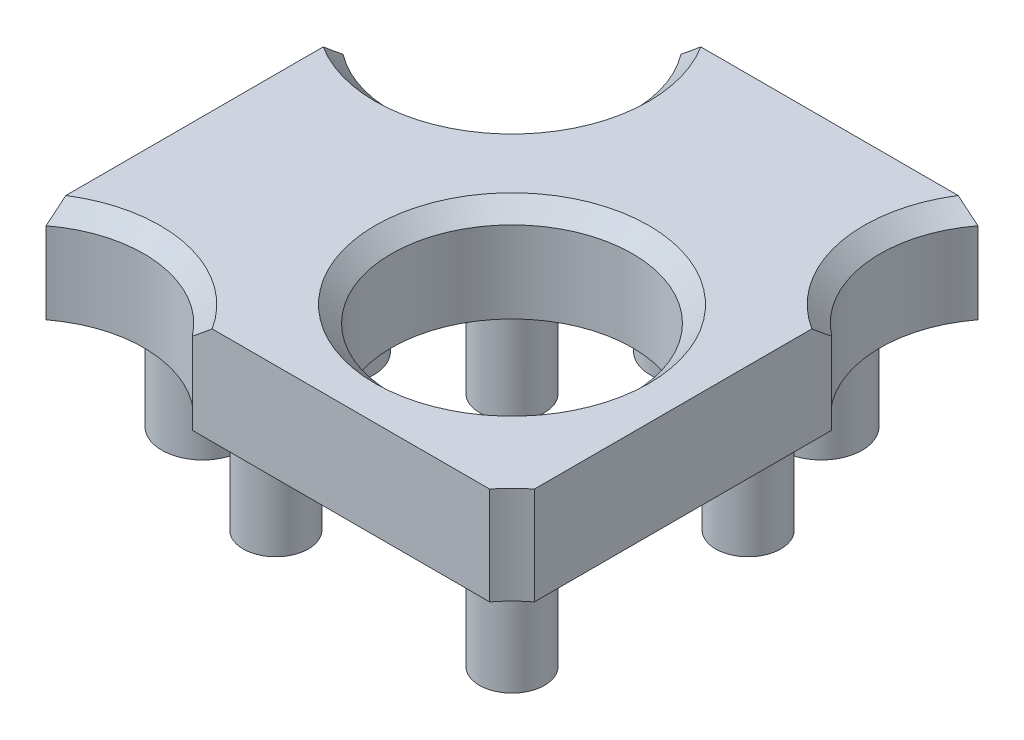
ISO-10303-21;
HEADER;
FILE_DESCRIPTION(('STEP AP214'),'2;1');
FILE_NAME('part.step','',(''),(''),'','','');
FILE_SCHEMA(('AUTOMOTIVE_DESIGN { 1 0 10303 214 1 1 1 1 }'));
ENDSEC;
DATA;
#1=APPLICATION_CONTEXT('core data for automotive mechanical design processes');
#2=APPLICATION_PROTOCOL_DEFINITION('international standard','automotive_design',2000,#1);
#3=PRODUCT_CONTEXT('',#1,'mechanical');
#4=PRODUCT('Part','Part','',(#3));
#5=PRODUCT_RELATED_PRODUCT_CATEGORY('part','',(#4));
#6=PRODUCT_DEFINITION_FORMATION('','',#4);
#7=PRODUCT_DEFINITION_CONTEXT('part definition',#1,'design');
#8=PRODUCT_DEFINITION('design','',#6,#7);
#9=PRODUCT_DEFINITION_SHAPE('','',#8);
#10=(LENGTH_UNIT() NAMED_UNIT(*) SI_UNIT(.MILLI.,.METRE.));
#11=(NAMED_UNIT(*) PLANE_ANGLE_UNIT() SI_UNIT($,.RADIAN.));
#12=(NAMED_UNIT(*) SI_UNIT($,.STERADIAN.) SOLID_ANGLE_UNIT());
#13=UNCERTAINTY_MEASURE_WITH_UNIT(LENGTH_MEASURE(1.E-05),#10,'distance_accuracy_value','');
#14=(GEOMETRIC_REPRESENTATION_CONTEXT(3) GLOBAL_UNCERTAINTY_ASSIGNED_CONTEXT((#13)) GLOBAL_UNIT_ASSIGNED_CONTEXT((#10,
#11,#12)) REPRESENTATION_CONTEXT('',''));
#15=CARTESIAN_POINT('',(0.,0.,0.));
#16=DIRECTION('',(0.,0.,1.));
#17=DIRECTION('',(1.,0.,0.));
#18=AXIS2_PLACEMENT_3D('',#15,#16,#17);
#19=CARTESIAN_POINT('',(10.5,12.,10.5));
#20=DIRECTION('',(-1.,0.,0.));
#21=DIRECTION('',(0.,0.,1.));
#22=AXIS2_PLACEMENT_3D('',#19,#20,#21);
#23=PLANE('',#22);
#24=DIRECTION('',(0.,1.,0.));
#25=VECTOR('',#24,1.);
#26=CARTESIAN_POINT('',(10.5,1.,-9.12547874291017));
#27=LINE('',#26,#25);
#28=CARTESIAN_POINT('',(10.5,6.,-9.12547874291017));
#29=VERTEX_POINT('',#28);
#30=CARTESIAN_POINT('',(10.5,11.,-9.12547874291017));
#31=VERTEX_POINT('',#30);
#32=EDGE_CURVE('E418',#29,#31,#27,.T.);
#33=ORIENTED_EDGE('',*,*,#32,.T.);
#34=CARTESIAN_POINT('',(10.5,11.,-9.12547874291017));
#35=CARTESIAN_POINT('',(10.5,11.0816793844325,-9.02259457323716));
#36=CARTESIAN_POINT('',(10.5,11.1638393771911,-8.92009342663814));
#37=CARTESIAN_POINT('',(10.5,11.329013575507,-8.71579109963367));
#38=CARTESIAN_POINT('',(10.5,11.4120277323689,-8.61398987987178));
#39=CARTESIAN_POINT('',(10.5,11.5788116752335,-8.41101072911728));
#40=CARTESIAN_POINT('',(10.5,11.6625814533899,-8.30983279167083));
#41=CARTESIAN_POINT('',(10.5,11.8308015923563,-8.10803441972613));
#42=CARTESIAN_POINT('',(10.5,11.9152519914586,-8.0074140171402));
#43=CARTESIAN_POINT('',(10.5,12.,-7.9070457494778));
#44=B_SPLINE_CURVE_WITH_KNOTS('',3,(#34,#35,#36,#37,#38,#39,#40,#41,#42,#43),.UNSPECIFIED.,.F.,
.F.,(4,2,2,2,4),(0.,0.394090890222562,0.788159436703919,1.18222389588493,1.57631068233785),.UNSPECIFIED.);
#45=CARTESIAN_POINT('',(10.5,12.,-7.90704574947783));
#46=VERTEX_POINT('',#45);
#47=EDGE_CURVE('E72',#31,#46,#44,.T.);
#48=ORIENTED_EDGE('',*,*,#47,.T.);
#49=DIRECTION('',(0.,0.,-1.));
#50=VECTOR('',#49,1.);
#51=CARTESIAN_POINT('',(10.5,12.,10.5));
#52=LINE('',#51,#50);
#53=CARTESIAN_POINT('',(10.5,12.,9.12547874291018));
#54=VERTEX_POINT('',#53);
#55=EDGE_CURVE('E193',#54,#46,#52,.T.);
#56=ORIENTED_EDGE('',*,*,#55,.F.);
#57=DIRECTION('',(0.,1.,0.));
#58=VECTOR('',#57,1.);
#59=CARTESIAN_POINT('',(10.5,1.,9.12547874291018));
#60=LINE('',#59,#58);
#61=CARTESIAN_POINT('',(10.5,6.,9.12547874291018));
#62=VERTEX_POINT('',#61);
#63=EDGE_CURVE('E424',#54,#62,#60,.F.);
#64=ORIENTED_EDGE('',*,*,#63,.T.);
#65=DIRECTION('',(0.,0.,1.));
#66=VECTOR('',#65,1.);
#67=CARTESIAN_POINT('',(10.5,6.,-19.49));
#68=LINE('',#67,#66);
#69=EDGE_CURVE('E189',#29,#62,#68,.T.);
#70=ORIENTED_EDGE('',*,*,#69,.F.);
#71=EDGE_LOOP('',(#33,#48,#56,#64,#70));
#72=FACE_BOUND('',#71,.T.);
#73=ADVANCED_FACE('F48',(#72),#23,.F.);
#74=CARTESIAN_POINT('',(-10.5,12.,10.5));
#75=DIRECTION('',(0.,0.,-1.));
#76=DIRECTION('',(-1.,0.,0.));
#77=AXIS2_PLACEMENT_3D('',#74,#75,#76);
#78=PLANE('',#77);
#79=DIRECTION('',(1.,0.,0.));
#80=VECTOR('',#79,1.);
#81=CARTESIAN_POINT('',(-10.5,12.,10.5));
#82=LINE('',#81,#80);
#83=CARTESIAN_POINT('',(-7.90704574947792,12.,10.5));
#84=VERTEX_POINT('',#83);
#85=CARTESIAN_POINT('',(9.12547874291021,12.,10.5));
#86=VERTEX_POINT('',#85);
#87=EDGE_CURVE('E196',#84,#86,#82,.T.);
#88=ORIENTED_EDGE('',*,*,#87,.F.);
#89=CARTESIAN_POINT('',(-7.90704574947792,12.,10.5));
#90=CARTESIAN_POINT('',(-8.00741401714029,11.9152519914586,10.5));
#91=CARTESIAN_POINT('',(-8.10803441972621,11.8308015923563,10.5));
#92=CARTESIAN_POINT('',(-8.3098327916709,11.6625814533899,10.5));
#93=CARTESIAN_POINT('',(-8.41101072911735,11.5788116752335,10.5));
#94=CARTESIAN_POINT('',(-8.61398987987186,11.4120277323689,10.5));
#95=CARTESIAN_POINT('',(-8.71579109963375,11.3290135755071,10.5));
#96=CARTESIAN_POINT('',(-8.9200934266382,11.1638393771911,10.5));
#97=CARTESIAN_POINT('',(-9.0225945732372,11.0816793844324,10.5));
#98=CARTESIAN_POINT('',(-9.12547874291016,10.9999999999999,10.5));
#99=B_SPLINE_CURVE_WITH_KNOTS('',3,(#89,#90,#91,#92,#93,#94,#95,#96,#97,#98),.UNSPECIFIED.,.F.,
.F.,(4,2,2,2,4),(0.,0.39408678645292,0.78815124563393,1.18221979211528,1.57631068233784),.UNSPECIFIED.);
#100=CARTESIAN_POINT('',(-9.12547874291024,11.,10.5));
#101=VERTEX_POINT('',#100);
#102=EDGE_CURVE('E431',#84,#101,#99,.T.);
#103=ORIENTED_EDGE('',*,*,#102,.T.);
#104=DIRECTION('',(0.,1.,0.));
#105=VECTOR('',#104,1.);
#106=CARTESIAN_POINT('',(-9.12547874291024,1.,10.5));
#107=LINE('',#106,#105);
#108=CARTESIAN_POINT('',(-9.12547874291024,6.,10.5));
#109=VERTEX_POINT('',#108);
#110=EDGE_CURVE('E158',#101,#109,#107,.F.);
#111=ORIENTED_EDGE('',*,*,#110,.T.);
#112=DIRECTION('',(-1.,0.,0.));
#113=VECTOR('',#112,1.);
#114=CARTESIAN_POINT('',(-10.5,6.,10.5));
#115=LINE('',#114,#113);
#116=CARTESIAN_POINT('',(9.12547874291021,6.,10.5));
#117=VERTEX_POINT('',#116);
#118=EDGE_CURVE('E157',#117,#109,#115,.T.);
#119=ORIENTED_EDGE('',*,*,#118,.F.);
#120=DIRECTION('',(0.,1.,0.));
#121=VECTOR('',#120,1.);
#122=CARTESIAN_POINT('',(9.12547874291021,1.,10.5));
#123=LINE('',#122,#121);
#124=EDGE_CURVE('E421',#117,#86,#123,.T.);
#125=ORIENTED_EDGE('',*,*,#124,.T.);
#126=EDGE_LOOP('',(#88,#103,#111,#119,#125));
#127=FACE_BOUND('',#126,.T.);
#128=ADVANCED_FACE('F304',(#127),#78,.F.);
#129=CARTESIAN_POINT('',(0.,12.,0.));
#130=DIRECTION('',(0.,-1.,0.));
#131=DIRECTION('',(0.,0.,-1.));
#132=AXIS2_PLACEMENT_3D('',#129,#130,#131);
#133=PLANE('',#132);
#134=CARTESIAN_POINT('',(0.,12.,0.));
#135=DIRECTION('',(0.,-1.,0.));
#136=DIRECTION('',(0.,0.,-1.));
#137=AXIS2_PLACEMENT_3D('',#134,#135,#136);
#138=CIRCLE('',#137,8.4);
#139=CARTESIAN_POINT('',(0.,12.,-8.4));
#140=VERTEX_POINT('',#139);
#141=EDGE_CURVE('E224',#140,#140,#138,.T.);
#142=ORIENTED_EDGE('',*,*,#141,.T.);
#143=EDGE_LOOP('',(#142));
#144=FACE_BOUND('',#143,.T.);
#145=DIRECTION('',(0.,0.,-1.));
#146=VECTOR('',#145,1.);
#147=CARTESIAN_POINT('',(-19.49,12.,-10.4999999999999));
#148=LINE('',#147,#146);
#149=CARTESIAN_POINT('',(-19.49,12.,7.90071130323578));
#150=VERTEX_POINT('',#149);
#151=CARTESIAN_POINT('',(-19.49,12.,-7.9007113032361));
#152=VERTEX_POINT('',#151);
#153=EDGE_CURVE('E164',#150,#152,#148,.T.);
#154=ORIENTED_EDGE('',*,*,#153,.F.);
#155=CARTESIAN_POINT('',(-15.0000000000002,12.,14.9999999999998));
#156=DIRECTION('',(0.,-1.,0.));
#157=DIRECTION('',(0.,0.,-1.));
#158=AXIS2_PLACEMENT_3D('',#155,#156,#157);
#159=CIRCLE('',#158,8.40000000000002);
#160=EDGE_CURVE('E432',#150,#84,#159,.T.);
#161=ORIENTED_EDGE('',*,*,#160,.T.);
#162=ORIENTED_EDGE('',*,*,#87,.T.);
#163=CARTESIAN_POINT('',(15.,12.,15.));
#164=DIRECTION('',(0.,1.,0.));
#165=DIRECTION('',(0.,0.,-1.));
#166=AXIS2_PLACEMENT_3D('',#163,#164,#165);
#167=CIRCLE('',#166,7.4);
#168=EDGE_CURVE('E159',#54,#86,#167,.T.);
#169=ORIENTED_EDGE('',*,*,#168,.F.);
#170=ORIENTED_EDGE('',*,*,#55,.T.);
#171=CARTESIAN_POINT('',(15.0000000000001,12.,-14.9999999999999));
#172=DIRECTION('',(0.,-1.,0.));
#173=DIRECTION('',(0.,0.,-1.));
#174=AXIS2_PLACEMENT_3D('',#171,#172,#173);
#175=CIRCLE('',#174,8.40000000000001);
#176=CARTESIAN_POINT('',(7.90071130323616,12.,-19.49));
#177=VERTEX_POINT('',#176);
#178=EDGE_CURVE('E436',#46,#177,#175,.T.);
#179=ORIENTED_EDGE('',*,*,#178,.T.);
#180=DIRECTION('',(1.,0.,0.));
#181=VECTOR('',#180,1.);
#182=CARTESIAN_POINT('',(10.5,12.,-19.49));
#183=LINE('',#182,#181);
#184=CARTESIAN_POINT('',(-7.90071130323607,12.,-19.49));
#185=VERTEX_POINT('',#184);
#186=EDGE_CURVE('E186',#185,#177,#183,.T.);
#187=ORIENTED_EDGE('',*,*,#186,.F.);
#188=CARTESIAN_POINT('',(-15.,12.,-15.));
#189=DIRECTION('',(0.,-1.,0.));
#190=DIRECTION('',(0.,0.,-1.));
#191=AXIS2_PLACEMENT_3D('',#188,#189,#190);
#192=CIRCLE('',#191,8.4);
#193=EDGE_CURVE('E443',#185,#152,#192,.T.);
#194=ORIENTED_EDGE('',*,*,#193,.T.);
#195=EDGE_LOOP('',(#154,#161,#162,#169,#170,#179,#187,#194));
#196=FACE_BOUND('',#195,.T.);
#197=ADVANCED_FACE('F330',(#144,#196),#133,.F.);
#198=CARTESIAN_POINT('',(0.,-0.000999999999999265,0.));
#199=DIRECTION('',(0.,1.,0.));
#200=DIRECTION('',(0.,0.,1.));
#201=AXIS2_PLACEMENT_3D('',#198,#199,#200);
#202=CYLINDRICAL_SURFACE('',#201,7.4);
#203=CARTESIAN_POINT('',(0.,11.,0.));
#204=DIRECTION('',(0.,-1.,0.));
#205=DIRECTION('',(0.,0.,-1.));
#206=AXIS2_PLACEMENT_3D('',#203,#204,#205);
#207=CIRCLE('',#206,7.4);
#208=CARTESIAN_POINT('',(0.,11.,-7.4));
#209=VERTEX_POINT('',#208);
#210=EDGE_CURVE('E221',#209,#209,#207,.F.);
#211=ORIENTED_EDGE('',*,*,#210,.T.);
#212=EDGE_LOOP('',(#211));
#213=FACE_BOUND('',#212,.T.);
#214=CARTESIAN_POINT('',(0.,6.,0.));
#215=DIRECTION('',(0.,1.,0.));
#216=DIRECTION('',(0.,0.,1.));
#217=AXIS2_PLACEMENT_3D('',#214,#215,#216);
#218=CIRCLE('',#217,7.4);
#219=CARTESIAN_POINT('',(0.,6.,7.4));
#220=VERTEX_POINT('',#219);
#221=EDGE_CURVE('E333',#220,#220,#218,.F.);
#222=ORIENTED_EDGE('',*,*,#221,.T.);
#223=EDGE_LOOP('',(#222));
#224=FACE_BOUND('',#223,.T.);
#225=ADVANCED_FACE('F328',(#213,#224),#202,.F.);
#226=CARTESIAN_POINT('',(10.5,6.,-19.49));
#227=DIRECTION('',(0.,1.,0.));
#228=DIRECTION('',(0.,0.,1.));
#229=AXIS2_PLACEMENT_3D('',#226,#227,#228);
#230=PLANE('',#229);
#231=CARTESIAN_POINT('',(-7.25,6.,-7.25000000000001));
#232=DIRECTION('',(0.,1.,0.));
#233=DIRECTION('',(0.,0.,1.));
#234=AXIS2_PLACEMENT_3D('',#231,#232,#233);
#235=CIRCLE('',#234,2.);
#236=CARTESIAN_POINT('',(-7.25,6.,-5.25000000000001));
#237=VERTEX_POINT('',#236);
#238=EDGE_CURVE('E218',#237,#237,#235,.F.);
#239=ORIENTED_EDGE('',*,*,#238,.F.);
#240=EDGE_LOOP('',(#239));
#241=FACE_BOUND('',#240,.T.);
#242=CARTESIAN_POINT('',(7.24999999999998,6.,-7.25000000000003));
#243=DIRECTION('',(0.,1.,0.));
#244=DIRECTION('',(0.,0.,1.));
#245=AXIS2_PLACEMENT_3D('',#242,#243,#244);
#246=CIRCLE('',#245,2.);
#247=CARTESIAN_POINT('',(7.24999999999998,6.,-5.25000000000003));
#248=VERTEX_POINT('',#247);
#249=EDGE_CURVE('E215',#248,#248,#246,.F.);
#250=ORIENTED_EDGE('',*,*,#249,.F.);
#251=EDGE_LOOP('',(#250));
#252=FACE_BOUND('',#251,.T.);
#253=CARTESIAN_POINT('',(7.24999999999995,6.,7.25000000000006));
#254=DIRECTION('',(0.,1.,0.));
#255=DIRECTION('',(0.,0.,1.));
#256=AXIS2_PLACEMENT_3D('',#253,#254,#255);
#257=CIRCLE('',#256,2.);
#258=CARTESIAN_POINT('',(7.24999999999995,6.,9.25000000000006));
#259=VERTEX_POINT('',#258);
#260=EDGE_CURVE('E212',#259,#259,#257,.F.);
#261=ORIENTED_EDGE('',*,*,#260,.F.);
#262=EDGE_LOOP('',(#261));
#263=FACE_BOUND('',#262,.T.);
#264=CARTESIAN_POINT('',(-7.24999999999998,6.,7.25000000000003));
#265=DIRECTION('',(0.,1.,0.));
#266=DIRECTION('',(0.,0.,1.));
#267=AXIS2_PLACEMENT_3D('',#264,#265,#266);
#268=CIRCLE('',#267,2.);
#269=CARTESIAN_POINT('',(-7.24999999999998,6.,9.25000000000003));
#270=VERTEX_POINT('',#269);
#271=EDGE_CURVE('E209',#270,#270,#268,.F.);
#272=ORIENTED_EDGE('',*,*,#271,.F.);
#273=EDGE_LOOP('',(#272));
#274=FACE_BOUND('',#273,.T.);
#275=CARTESIAN_POINT('',(-4.,6.,-14.995));
#276=DIRECTION('',(0.,1.,0.));
#277=DIRECTION('',(0.,0.,-1.));
#278=AXIS2_PLACEMENT_3D('',#275,#276,#277);
#279=CIRCLE('',#278,2.5);
#280=CARTESIAN_POINT('',(-4.,6.,-17.495));
#281=VERTEX_POINT('',#280);
#282=EDGE_CURVE('E168',#281,#281,#279,.T.);
#283=ORIENTED_EDGE('',*,*,#282,.T.);
#284=EDGE_LOOP('',(#283));
#285=FACE_BOUND('',#284,.T.);
#286=CARTESIAN_POINT('',(4.,6.,-14.995));
#287=DIRECTION('',(0.,1.,0.));
#288=DIRECTION('',(0.,0.,1.));
#289=AXIS2_PLACEMENT_3D('',#286,#287,#288);
#290=CIRCLE('',#289,2.5);
#291=CARTESIAN_POINT('',(4.,6.,-12.495));
#292=VERTEX_POINT('',#291);
#293=EDGE_CURVE('E198',#292,#292,#290,.F.);
#294=ORIENTED_EDGE('',*,*,#293,.F.);
#295=EDGE_LOOP('',(#294));
#296=FACE_BOUND('',#295,.T.);
#297=DIRECTION('',(-1.,0.,0.));
#298=VECTOR('',#297,1.);
#299=CARTESIAN_POINT('',(10.5,6.,-19.49));
#300=LINE('',#299,#298);
#301=CARTESIAN_POINT('',(9.11783203232015,6.,-19.49));
#302=VERTEX_POINT('',#301);
#303=CARTESIAN_POINT('',(-9.11783203232006,6.,-19.49));
#304=VERTEX_POINT('',#303);
#305=EDGE_CURVE('E183',#302,#304,#300,.T.);
#306=ORIENTED_EDGE('',*,*,#305,.F.);
#307=CARTESIAN_POINT('',(15.0000000000001,6.,-14.9999999999999));
#308=DIRECTION('',(0.,1.,0.));
#309=DIRECTION('',(0.,0.,1.));
#310=AXIS2_PLACEMENT_3D('',#307,#308,#309);
#311=CIRCLE('',#310,7.4);
#312=EDGE_CURVE('E415',#302,#29,#311,.T.);
#313=ORIENTED_EDGE('',*,*,#312,.T.);
#314=ORIENTED_EDGE('',*,*,#69,.T.);
#315=CARTESIAN_POINT('',(15.,6.,15.));
#316=DIRECTION('',(0.,1.,0.));
#317=DIRECTION('',(0.,0.,1.));
#318=AXIS2_PLACEMENT_3D('',#315,#316,#317);
#319=CIRCLE('',#318,7.4);
#320=EDGE_CURVE('E207',#62,#117,#319,.T.);
#321=ORIENTED_EDGE('',*,*,#320,.T.);
#322=ORIENTED_EDGE('',*,*,#118,.T.);
#323=CARTESIAN_POINT('',(-15.0000000000002,6.,14.9999999999998));
#324=DIRECTION('',(0.,1.,0.));
#325=DIRECTION('',(0.,0.,1.));
#326=AXIS2_PLACEMENT_3D('',#323,#324,#325);
#327=CIRCLE('',#326,7.4);
#328=CARTESIAN_POINT('',(-19.49,6.,9.11783203231976));
#329=VERTEX_POINT('',#328);
#330=EDGE_CURVE('E139',#109,#329,#327,.T.);
#331=ORIENTED_EDGE('',*,*,#330,.T.);
#332=DIRECTION('',(0.,0.,1.));
#333=VECTOR('',#332,1.);
#334=CARTESIAN_POINT('',(-19.49,6.,-10.4999999999999));
#335=LINE('',#334,#333);
#336=CARTESIAN_POINT('',(-19.49,6.,-9.11783203232008));
#337=VERTEX_POINT('',#336);
#338=EDGE_CURVE('E154',#337,#329,#335,.T.);
#339=ORIENTED_EDGE('',*,*,#338,.F.);
#340=CARTESIAN_POINT('',(-15.,6.,-15.));
#341=DIRECTION('',(0.,1.,0.));
#342=DIRECTION('',(0.,0.,1.));
#343=AXIS2_PLACEMENT_3D('',#340,#341,#342);
#344=CIRCLE('',#343,7.4);
#345=EDGE_CURVE('E339',#337,#304,#344,.T.);
#346=ORIENTED_EDGE('',*,*,#345,.T.);
#347=EDGE_LOOP('',(#306,#313,#314,#321,#322,#331,#339,#346));
#348=FACE_BOUND('',#347,.T.);
#349=CARTESIAN_POINT('',(-14.995,6.,4.00000000000006));
#350=DIRECTION('',(0.,1.,0.));
#351=DIRECTION('',(-1.,0.,0.));
#352=AXIS2_PLACEMENT_3D('',#349,#350,#351);
#353=CIRCLE('',#352,2.5);
#354=CARTESIAN_POINT('',(-17.495,6.,4.00000000000006));
#355=VERTEX_POINT('',#354);
#356=EDGE_CURVE('E335',#355,#355,#353,.T.);
#357=ORIENTED_EDGE('',*,*,#356,.T.);
#358=EDGE_LOOP('',(#357));
#359=FACE_BOUND('',#358,.T.);
#360=CARTESIAN_POINT('',(-14.995,6.,-3.99999999999995));
#361=DIRECTION('',(0.,1.,0.));
#362=DIRECTION('',(0.,0.,1.));
#363=AXIS2_PLACEMENT_3D('',#360,#361,#362);
#364=CIRCLE('',#363,2.5);
#365=CARTESIAN_POINT('',(-14.995,6.,-1.49999999999995));
#366=VERTEX_POINT('',#365);
#367=EDGE_CURVE('E201',#366,#366,#364,.F.);
#368=ORIENTED_EDGE('',*,*,#367,.F.);
#369=EDGE_LOOP('',(#368));
#370=FACE_BOUND('',#369,.T.);
#371=ORIENTED_EDGE('',*,*,#221,.F.);
#372=EDGE_LOOP('',(#371));
#373=FACE_BOUND('',#372,.T.);
#374=ADVANCED_FACE('F151',(#241,#252,#263,#274,#285,#296,#348,#359,#370,#373),#230,.F.);
#375=CARTESIAN_POINT('',(0.,0.,-19.49));
#376=DIRECTION('',(0.,0.,-1.));
#377=DIRECTION('',(-1.,0.,0.));
#378=AXIS2_PLACEMENT_3D('',#375,#376,#377);
#379=PLANE('',#378);
#380=ORIENTED_EDGE('',*,*,#186,.T.);
#381=CARTESIAN_POINT('',(7.90071130323616,12.,-19.49));
#382=CARTESIAN_POINT('',(8.00097763059802,11.9152624356159,-19.49));
#383=CARTESIAN_POINT('',(8.10149450188462,11.8308203460445,-19.49));
#384=CARTESIAN_POINT('',(8.30308231160566,11.6626118156788,-19.49));
#385=CARTESIAN_POINT('',(8.40415321873438,11.5788453373569,-19.49));
#386=CARTESIAN_POINT('',(8.60691432079308,11.4120623776125,-19.49));
#387=CARTESIAN_POINT('',(8.70860452205229,11.3290459038766,-19.49));
#388=CARTESIAN_POINT('',(8.91268028117569,11.1638606186991,-19.49));
#389=CARTESIAN_POINT('',(9.01506587764576,11.081691854968,-19.49));
#390=CARTESIAN_POINT('',(9.11783203232008,10.9999999999999,-19.49));
#391=B_SPLINE_CURVE_WITH_KNOTS('',3,(#381,#382,#383,#384,#385,#386,#387,#388,#389,#390),
.UNSPECIFIED.,.F.,.F.,(4,2,2,2,4),(0.,0.393832940354124,0.78764385201941,1.18145879523493,
1.57529578335335),.UNSPECIFIED.);
#392=CARTESIAN_POINT('',(9.11783203232015,11.,-19.49));
#393=VERTEX_POINT('',#392);
#394=EDGE_CURVE('E58',#177,#393,#391,.T.);
#395=ORIENTED_EDGE('',*,*,#394,.T.);
#396=DIRECTION('',(0.,1.,0.));
#397=VECTOR('',#396,1.);
#398=CARTESIAN_POINT('',(9.11783203232015,1.,-19.49));
#399=LINE('',#398,#397);
#400=EDGE_CURVE('E145',#302,#393,#399,.T.);
#401=ORIENTED_EDGE('',*,*,#400,.F.);
#402=ORIENTED_EDGE('',*,*,#305,.T.);
#403=DIRECTION('',(0.,1.,0.));
#404=VECTOR('',#403,1.);
#405=CARTESIAN_POINT('',(-9.11783203232006,1.,-19.49));
#406=LINE('',#405,#404);
#407=CARTESIAN_POINT('',(-9.11783203232006,11.,-19.49));
#408=VERTEX_POINT('',#407);
#409=EDGE_CURVE('E336',#408,#304,#406,.F.);
#410=ORIENTED_EDGE('',*,*,#409,.F.);
#411=CARTESIAN_POINT('',(-9.11783203232006,11.,-19.49));
#412=CARTESIAN_POINT('',(-9.0150658776457,11.081691854968,-19.49));
#413=CARTESIAN_POINT('',(-8.91268028117561,11.1638606186992,-19.49));
#414=CARTESIAN_POINT('',(-8.7086045220522,11.3290459038766,-19.49));
#415=CARTESIAN_POINT('',(-8.60691432079299,11.4120623776125,-19.49));
#416=CARTESIAN_POINT('',(-8.40415321873429,11.5788453373569,-19.49));
#417=CARTESIAN_POINT('',(-8.30308231160558,11.6626118156788,-19.49));
#418=CARTESIAN_POINT('',(-8.10149450188454,11.8308203460445,-19.49));
#419=CARTESIAN_POINT('',(-8.00097763059792,11.9152624356159,-19.49));
#420=CARTESIAN_POINT('',(-7.90071130323604,12.,-19.49));
#421=B_SPLINE_CURVE_WITH_KNOTS('',3,(#411,#412,#413,#414,#415,#416,#417,#418,#419,#420),
.UNSPECIFIED.,.F.,.F.,(4,2,2,2,4),(0.,0.393836988118415,0.787651931333936,1.18146284299922,
1.57529578335334),.UNSPECIFIED.);
#422=EDGE_CURVE('E65',#408,#185,#421,.T.);
#423=ORIENTED_EDGE('',*,*,#422,.T.);
#424=EDGE_LOOP('',(#380,#395,#401,#402,#410,#423));
#425=FACE_BOUND('',#424,.T.);
#426=ADVANCED_FACE('F264',(#425),#379,.T.);
#427=CARTESIAN_POINT('',(4.,0.,-14.995));
#428=DIRECTION('',(0.,1.,0.));
#429=DIRECTION('',(0.,0.,1.));
#430=AXIS2_PLACEMENT_3D('',#427,#428,#429);
#431=CYLINDRICAL_SURFACE('',#430,2.5);
#432=CARTESIAN_POINT('',(4.,0.,-14.995));
#433=DIRECTION('',(0.,-1.,0.));
#434=DIRECTION('',(0.,0.,-1.));
#435=AXIS2_PLACEMENT_3D('',#432,#433,#434);
#436=CIRCLE('',#435,2.5);
#437=CARTESIAN_POINT('',(4.,0.,-17.495));
#438=VERTEX_POINT('',#437);
#439=EDGE_CURVE('E178',#438,#438,#436,.T.);
#440=ORIENTED_EDGE('',*,*,#439,.F.);
#441=EDGE_LOOP('',(#440));
#442=FACE_BOUND('',#441,.T.);
#443=ORIENTED_EDGE('',*,*,#293,.T.);
#444=EDGE_LOOP('',(#443));
#445=FACE_BOUND('',#444,.T.);
#446=ADVANCED_FACE('F260',(#442,#445),#431,.T.);
#447=CARTESIAN_POINT('',(4.,0.,-14.995));
#448=DIRECTION('',(0.,-1.,0.));
#449=DIRECTION('',(0.,0.,-1.));
#450=AXIS2_PLACEMENT_3D('',#447,#448,#449);
#451=PLANE('',#450);
#452=ORIENTED_EDGE('',*,*,#439,.T.);
#453=EDGE_LOOP('',(#452));
#454=FACE_BOUND('',#453,.T.);
#455=ADVANCED_FACE('F256',(#454),#451,.T.);
#456=CARTESIAN_POINT('',(-4.,0.,-14.995));
#457=DIRECTION('',(0.,1.,0.));
#458=DIRECTION('',(0.,0.,1.));
#459=AXIS2_PLACEMENT_3D('',#456,#457,#458);
#460=CYLINDRICAL_SURFACE('',#459,2.5);
#461=CARTESIAN_POINT('',(-4.,0.,-14.995));
#462=DIRECTION('',(0.,1.,0.));
#463=DIRECTION('',(0.,0.,-1.));
#464=AXIS2_PLACEMENT_3D('',#461,#462,#463);
#465=CIRCLE('',#464,2.5);
#466=CARTESIAN_POINT('',(-4.,0.,-17.495));
#467=VERTEX_POINT('',#466);
#468=EDGE_CURVE('E175',#467,#467,#465,.T.);
#469=ORIENTED_EDGE('',*,*,#468,.T.);
#470=EDGE_LOOP('',(#469));
#471=FACE_BOUND('',#470,.T.);
#472=ORIENTED_EDGE('',*,*,#282,.F.);
#473=EDGE_LOOP('',(#472));
#474=FACE_BOUND('',#473,.T.);
#475=ADVANCED_FACE('F252',(#471,#474),#460,.T.);
#476=CARTESIAN_POINT('',(-4.,0.,-14.995));
#477=DIRECTION('',(0.,-1.,0.));
#478=DIRECTION('',(0.,0.,-1.));
#479=AXIS2_PLACEMENT_3D('',#476,#477,#478);
#480=PLANE('',#479);
#481=ORIENTED_EDGE('',*,*,#468,.F.);
#482=EDGE_LOOP('',(#481));
#483=FACE_BOUND('',#482,.T.);
#484=ADVANCED_FACE('F247',(#483),#480,.T.);
#485=CARTESIAN_POINT('',(-19.49,0.,0.));
#486=DIRECTION('',(-1.,0.,0.));
#487=DIRECTION('',(0.,0.,1.));
#488=AXIS2_PLACEMENT_3D('',#485,#486,#487);
#489=PLANE('',#488);
#490=DIRECTION('',(0.,1.,0.));
#491=VECTOR('',#490,1.);
#492=CARTESIAN_POINT('',(-19.49,1.,9.11783203231976));
#493=LINE('',#492,#491);
#494=CARTESIAN_POINT('',(-19.49,11.,9.11783203231976));
#495=VERTEX_POINT('',#494);
#496=EDGE_CURVE('E135',#495,#329,#493,.F.);
#497=ORIENTED_EDGE('',*,*,#496,.F.);
#498=CARTESIAN_POINT('',(-19.49,11.,9.11783203231976));
#499=CARTESIAN_POINT('',(-19.49,11.081691854968,9.0150658776454));
#500=CARTESIAN_POINT('',(-19.49,11.1638606186992,8.91268028117531));
#501=CARTESIAN_POINT('',(-19.49,11.3290459038766,8.7086045220519));
#502=CARTESIAN_POINT('',(-19.49,11.4120623776125,8.60691432079269));
#503=CARTESIAN_POINT('',(-19.49,11.5788453373569,8.404153218734));
#504=CARTESIAN_POINT('',(-19.49,11.6626118156788,8.30308231160529));
#505=CARTESIAN_POINT('',(-19.49,11.8308203460445,8.10149450188424));
#506=CARTESIAN_POINT('',(-19.49,11.9152624356159,8.00097763059763));
#507=CARTESIAN_POINT('',(-19.49,12.,7.90071130323575));
#508=B_SPLINE_CURVE_WITH_KNOTS('',3,(#498,#499,#500,#501,#502,#503,#504,#505,#506,#507),
.UNSPECIFIED.,.F.,.F.,(4,2,2,2,4),(0.,0.393836988118414,0.787651931333933,1.18146284299921,
1.57529578335333),.UNSPECIFIED.);
#509=EDGE_CURVE('E235',#495,#150,#508,.T.);
#510=ORIENTED_EDGE('',*,*,#509,.T.);
#511=ORIENTED_EDGE('',*,*,#153,.T.);
#512=CARTESIAN_POINT('',(-19.49,12.,-7.9007113032361));
#513=CARTESIAN_POINT('',(-19.49,11.9152624356159,-8.00097763059796));
#514=CARTESIAN_POINT('',(-19.49,11.8308203460445,-8.10149450188456));
#515=CARTESIAN_POINT('',(-19.49,11.6626118156788,-8.30308231160559));
#516=CARTESIAN_POINT('',(-19.49,11.5788453373569,-8.40415321873431));
#517=CARTESIAN_POINT('',(-19.49,11.4120623776125,-8.60691432079301));
#518=CARTESIAN_POINT('',(-19.49,11.3290459038766,-8.70860452205223));
#519=CARTESIAN_POINT('',(-19.49,11.1638606186991,-8.91268028117562));
#520=CARTESIAN_POINT('',(-19.49,11.081691854968,-9.01506587764569));
#521=CARTESIAN_POINT('',(-19.49,10.9999999999999,-9.11783203232001));
#522=B_SPLINE_CURVE_WITH_KNOTS('',3,(#512,#513,#514,#515,#516,#517,#518,#519,#520,#521),
.UNSPECIFIED.,.F.,.F.,(4,2,2,2,4),(0.,0.393832940354122,0.787643852019409,1.18145879523493,
1.57529578335335),.UNSPECIFIED.);
#523=CARTESIAN_POINT('',(-19.49,11.,-9.11783203232008));
#524=VERTEX_POINT('',#523);
#525=EDGE_CURVE('E228',#152,#524,#522,.T.);
#526=ORIENTED_EDGE('',*,*,#525,.T.);
#527=DIRECTION('',(0.,1.,0.));
#528=VECTOR('',#527,1.);
#529=CARTESIAN_POINT('',(-19.49,1.,-9.11783203232008));
#530=LINE('',#529,#528);
#531=EDGE_CURVE('E146',#337,#524,#530,.T.);
#532=ORIENTED_EDGE('',*,*,#531,.F.);
#533=ORIENTED_EDGE('',*,*,#338,.T.);
#534=EDGE_LOOP('',(#497,#510,#511,#526,#532,#533));
#535=FACE_BOUND('',#534,.T.);
#536=ADVANCED_FACE('F162',(#535),#489,.T.);
#537=CARTESIAN_POINT('',(-14.995,0.,-3.99999999999995));
#538=DIRECTION('',(0.,1.,0.));
#539=DIRECTION('',(0.,0.,1.));
#540=AXIS2_PLACEMENT_3D('',#537,#538,#539);
#541=CYLINDRICAL_SURFACE('',#540,2.5);
#542=CARTESIAN_POINT('',(-14.995,0.,-3.99999999999995));
#543=DIRECTION('',(0.,-1.,0.));
#544=DIRECTION('',(-1.,0.,0.));
#545=AXIS2_PLACEMENT_3D('',#542,#543,#544);
#546=CIRCLE('',#545,2.5);
#547=CARTESIAN_POINT('',(-17.495,0.,-3.99999999999994));
#548=VERTEX_POINT('',#547);
#549=EDGE_CURVE('E165',#548,#548,#546,.T.);
#550=ORIENTED_EDGE('',*,*,#549,.F.);
#551=EDGE_LOOP('',(#550));
#552=FACE_BOUND('',#551,.T.);
#553=ORIENTED_EDGE('',*,*,#367,.T.);
#554=EDGE_LOOP('',(#553));
#555=FACE_BOUND('',#554,.T.);
#556=ADVANCED_FACE('F246',(#552,#555),#541,.T.);
#557=CARTESIAN_POINT('',(-14.995,0.,-3.99999999999995));
#558=DIRECTION('',(0.,-1.,0.));
#559=DIRECTION('',(-1.,0.,0.));
#560=AXIS2_PLACEMENT_3D('',#557,#558,#559);
#561=PLANE('',#560);
#562=ORIENTED_EDGE('',*,*,#549,.T.);
#563=EDGE_LOOP('',(#562));
#564=FACE_BOUND('',#563,.T.);
#565=ADVANCED_FACE('F360',(#564),#561,.T.);
#566=CARTESIAN_POINT('',(-14.995,0.,4.00000000000006));
#567=DIRECTION('',(0.,1.,0.));
#568=DIRECTION('',(0.,0.,1.));
#569=AXIS2_PLACEMENT_3D('',#566,#567,#568);
#570=CYLINDRICAL_SURFACE('',#569,2.5);
#571=CARTESIAN_POINT('',(-14.995,0.,4.00000000000006));
#572=DIRECTION('',(0.,1.,0.));
#573=DIRECTION('',(-1.,0.,0.));
#574=AXIS2_PLACEMENT_3D('',#571,#572,#573);
#575=CIRCLE('',#574,2.5);
#576=CARTESIAN_POINT('',(-17.495,0.,4.00000000000006));
#577=VERTEX_POINT('',#576);
#578=EDGE_CURVE('E171',#577,#577,#575,.T.);
#579=ORIENTED_EDGE('',*,*,#578,.T.);
#580=EDGE_LOOP('',(#579));
#581=FACE_BOUND('',#580,.T.);
#582=ORIENTED_EDGE('',*,*,#356,.F.);
#583=EDGE_LOOP('',(#582));
#584=FACE_BOUND('',#583,.T.);
#585=ADVANCED_FACE('F346',(#581,#584),#570,.T.);
#586=CARTESIAN_POINT('',(-14.995,0.,4.00000000000006));
#587=DIRECTION('',(0.,-1.,0.));
#588=DIRECTION('',(-1.,0.,0.));
#589=AXIS2_PLACEMENT_3D('',#586,#587,#588);
#590=PLANE('',#589);
#591=ORIENTED_EDGE('',*,*,#578,.F.);
#592=EDGE_LOOP('',(#591));
#593=FACE_BOUND('',#592,.T.);
#594=ADVANCED_FACE('F349',(#593),#590,.T.);
#595=CARTESIAN_POINT('',(-15.,1.,-15.));
#596=DIRECTION('',(0.,1.,0.));
#597=DIRECTION('',(0.,0.,1.));
#598=AXIS2_PLACEMENT_3D('',#595,#596,#597);
#599=CYLINDRICAL_SURFACE('',#598,7.4);
#600=ORIENTED_EDGE('',*,*,#531,.T.);
#601=CARTESIAN_POINT('',(-15.,11.,-15.));
#602=DIRECTION('',(0.,-1.,0.));
#603=DIRECTION('',(0.,0.,-1.));
#604=AXIS2_PLACEMENT_3D('',#601,#602,#603);
#605=CIRCLE('',#604,7.4);
#606=EDGE_CURVE('E12',#524,#408,#605,.F.);
#607=ORIENTED_EDGE('',*,*,#606,.T.);
#608=ORIENTED_EDGE('',*,*,#409,.T.);
#609=ORIENTED_EDGE('',*,*,#345,.F.);
#610=EDGE_LOOP('',(#600,#607,#608,#609));
#611=FACE_BOUND('',#610,.T.);
#612=ADVANCED_FACE('F351',(#611),#599,.F.);
#613=CARTESIAN_POINT('',(-15.0000000000002,1.,14.9999999999998));
#614=DIRECTION('',(0.,1.,0.));
#615=DIRECTION('',(0.,0.,1.));
#616=AXIS2_PLACEMENT_3D('',#613,#614,#615);
#617=CYLINDRICAL_SURFACE('',#616,7.4);
#618=ORIENTED_EDGE('',*,*,#110,.F.);
#619=CARTESIAN_POINT('',(-15.0000000000002,11.,14.9999999999998));
#620=DIRECTION('',(0.,-1.,0.));
#621=DIRECTION('',(0.,0.,-1.));
#622=AXIS2_PLACEMENT_3D('',#619,#620,#621);
#623=CIRCLE('',#622,7.4);
#624=EDGE_CURVE('E142',#101,#495,#623,.F.);
#625=ORIENTED_EDGE('',*,*,#624,.T.);
#626=ORIENTED_EDGE('',*,*,#496,.T.);
#627=ORIENTED_EDGE('',*,*,#330,.F.);
#628=EDGE_LOOP('',(#618,#625,#626,#627));
#629=FACE_BOUND('',#628,.T.);
#630=ADVANCED_FACE('F138',(#629),#617,.F.);
#631=CARTESIAN_POINT('',(15.0000000000001,1.,-14.9999999999999));
#632=DIRECTION('',(0.,1.,0.));
#633=DIRECTION('',(0.,0.,1.));
#634=AXIS2_PLACEMENT_3D('',#631,#632,#633);
#635=CYLINDRICAL_SURFACE('',#634,7.4);
#636=ORIENTED_EDGE('',*,*,#400,.T.);
#637=CARTESIAN_POINT('',(15.0000000000001,11.,-14.9999999999999));
#638=DIRECTION('',(0.,-1.,0.));
#639=DIRECTION('',(0.,0.,-1.));
#640=AXIS2_PLACEMENT_3D('',#637,#638,#639);
#641=CIRCLE('',#640,7.4);
#642=EDGE_CURVE('E299',#393,#31,#641,.F.);
#643=ORIENTED_EDGE('',*,*,#642,.T.);
#644=ORIENTED_EDGE('',*,*,#32,.F.);
#645=ORIENTED_EDGE('',*,*,#312,.F.);
#646=EDGE_LOOP('',(#636,#643,#644,#645));
#647=FACE_BOUND('',#646,.T.);
#648=ADVANCED_FACE('F430',(#647),#635,.F.);
#649=CARTESIAN_POINT('',(15.,1.,15.));
#650=DIRECTION('',(0.,1.,0.));
#651=DIRECTION('',(0.,0.,1.));
#652=AXIS2_PLACEMENT_3D('',#649,#650,#651);
#653=CYLINDRICAL_SURFACE('',#652,7.4);
#654=ORIENTED_EDGE('',*,*,#168,.T.);
#655=ORIENTED_EDGE('',*,*,#124,.F.);
#656=ORIENTED_EDGE('',*,*,#320,.F.);
#657=ORIENTED_EDGE('',*,*,#63,.F.);
#658=EDGE_LOOP('',(#654,#655,#656,#657));
#659=FACE_BOUND('',#658,.T.);
#660=ADVANCED_FACE('F397',(#659),#653,.F.);
#661=CARTESIAN_POINT('',(-7.24999999999998,-5.65685424949238,7.25000000000003));
#662=DIRECTION('',(0.,1.,0.));
#663=DIRECTION('',(0.,0.,1.));
#664=AXIS2_PLACEMENT_3D('',#661,#662,#663);
#665=CYLINDRICAL_SURFACE('',#664,2.);
#666=ORIENTED_EDGE('',*,*,#271,.T.);
#667=EDGE_LOOP('',(#666));
#668=FACE_BOUND('',#667,.T.);
#669=CARTESIAN_POINT('',(-7.24999999999998,0.,7.25000000000003));
#670=DIRECTION('',(0.,-1.,0.));
#671=DIRECTION('',(0.,0.,-1.));
#672=AXIS2_PLACEMENT_3D('',#669,#670,#671);
#673=CIRCLE('',#672,2.);
#674=CARTESIAN_POINT('',(-7.24999999999998,0.,5.25000000000003));
#675=VERTEX_POINT('',#674);
#676=EDGE_CURVE('E401',#675,#675,#673,.T.);
#677=ORIENTED_EDGE('',*,*,#676,.F.);
#678=EDGE_LOOP('',(#677));
#679=FACE_BOUND('',#678,.T.);
#680=ADVANCED_FACE('F393',(#668,#679),#665,.T.);
#681=CARTESIAN_POINT('',(-14.995,0.,4.00000000000006));
#682=DIRECTION('',(0.,-1.,0.));
#683=DIRECTION('',(-1.,0.,0.));
#684=AXIS2_PLACEMENT_3D('',#681,#682,#683);
#685=PLANE('',#684);
#686=ORIENTED_EDGE('',*,*,#676,.T.);
#687=EDGE_LOOP('',(#686));
#688=FACE_BOUND('',#687,.T.);
#689=ADVANCED_FACE('F396',(#688),#685,.T.);
#690=CARTESIAN_POINT('',(7.24999999999995,-5.65685424949238,7.25000000000006));
#691=DIRECTION('',(0.,1.,0.));
#692=DIRECTION('',(0.,0.,1.));
#693=AXIS2_PLACEMENT_3D('',#690,#691,#692);
#694=CYLINDRICAL_SURFACE('',#693,2.);
#695=ORIENTED_EDGE('',*,*,#260,.T.);
#696=EDGE_LOOP('',(#695));
#697=FACE_BOUND('',#696,.T.);
#698=CARTESIAN_POINT('',(7.24999999999995,0.,7.25000000000006));
#699=DIRECTION('',(0.,-1.,0.));
#700=DIRECTION('',(0.,0.,-1.));
#701=AXIS2_PLACEMENT_3D('',#698,#699,#700);
#702=CIRCLE('',#701,2.);
#703=CARTESIAN_POINT('',(7.24999999999995,0.,5.25000000000006));
#704=VERTEX_POINT('',#703);
#705=EDGE_CURVE('E411',#704,#704,#702,.T.);
#706=ORIENTED_EDGE('',*,*,#705,.F.);
#707=EDGE_LOOP('',(#706));
#708=FACE_BOUND('',#707,.T.);
#709=ADVANCED_FACE('F561',(#697,#708),#694,.T.);
#710=CARTESIAN_POINT('',(-14.995,0.,4.00000000000006));
#711=DIRECTION('',(0.,-1.,0.));
#712=DIRECTION('',(-1.,0.,0.));
#713=AXIS2_PLACEMENT_3D('',#710,#711,#712);
#714=PLANE('',#713);
#715=ORIENTED_EDGE('',*,*,#705,.T.);
#716=EDGE_LOOP('',(#715));
#717=FACE_BOUND('',#716,.T.);
#718=ADVANCED_FACE('F568',(#717),#714,.T.);
#719=CARTESIAN_POINT('',(7.24999999999998,-5.65685424949238,-7.25000000000003));
#720=DIRECTION('',(0.,1.,0.));
#721=DIRECTION('',(0.,0.,1.));
#722=AXIS2_PLACEMENT_3D('',#719,#720,#721);
#723=CYLINDRICAL_SURFACE('',#722,2.);
#724=ORIENTED_EDGE('',*,*,#249,.T.);
#725=EDGE_LOOP('',(#724));
#726=FACE_BOUND('',#725,.T.);
#727=CARTESIAN_POINT('',(7.24999999999998,0.,-7.25000000000003));
#728=DIRECTION('',(0.,-1.,0.));
#729=DIRECTION('',(0.,0.,-1.));
#730=AXIS2_PLACEMENT_3D('',#727,#728,#729);
#731=CIRCLE('',#730,2.);
#732=CARTESIAN_POINT('',(7.24999999999998,0.,-9.25000000000003));
#733=VERTEX_POINT('',#732);
#734=EDGE_CURVE('E408',#733,#733,#731,.T.);
#735=ORIENTED_EDGE('',*,*,#734,.F.);
#736=EDGE_LOOP('',(#735));
#737=FACE_BOUND('',#736,.T.);
#738=ADVANCED_FACE('F577',(#726,#737),#723,.T.);
#739=CARTESIAN_POINT('',(-14.995,0.,4.00000000000006));
#740=DIRECTION('',(0.,-1.,0.));
#741=DIRECTION('',(-1.,0.,0.));
#742=AXIS2_PLACEMENT_3D('',#739,#740,#741);
#743=PLANE('',#742);
#744=ORIENTED_EDGE('',*,*,#734,.T.);
#745=EDGE_LOOP('',(#744));
#746=FACE_BOUND('',#745,.T.);
#747=ADVANCED_FACE('F586',(#746),#743,.T.);
#748=CARTESIAN_POINT('',(-7.25,-5.65685424949238,-7.25000000000001));
#749=DIRECTION('',(0.,1.,0.));
#750=DIRECTION('',(0.,0.,1.));
#751=AXIS2_PLACEMENT_3D('',#748,#749,#750);
#752=CYLINDRICAL_SURFACE('',#751,2.);
#753=ORIENTED_EDGE('',*,*,#238,.T.);
#754=EDGE_LOOP('',(#753));
#755=FACE_BOUND('',#754,.T.);
#756=CARTESIAN_POINT('',(-7.25,0.,-7.25000000000001));
#757=DIRECTION('',(0.,-1.,0.));
#758=DIRECTION('',(0.,0.,-1.));
#759=AXIS2_PLACEMENT_3D('',#756,#757,#758);
#760=CIRCLE('',#759,2.);
#761=CARTESIAN_POINT('',(-7.25,0.,-9.25000000000001));
#762=VERTEX_POINT('',#761);
#763=EDGE_CURVE('E403',#762,#762,#760,.T.);
#764=ORIENTED_EDGE('',*,*,#763,.F.);
#765=EDGE_LOOP('',(#764));
#766=FACE_BOUND('',#765,.T.);
#767=ADVANCED_FACE('F321',(#755,#766),#752,.T.);
#768=CARTESIAN_POINT('',(-14.995,0.,4.00000000000006));
#769=DIRECTION('',(0.,-1.,0.));
#770=DIRECTION('',(-1.,0.,0.));
#771=AXIS2_PLACEMENT_3D('',#768,#769,#770);
#772=PLANE('',#771);
#773=ORIENTED_EDGE('',*,*,#763,.T.);
#774=EDGE_LOOP('',(#773));
#775=FACE_BOUND('',#774,.T.);
#776=ADVANCED_FACE('F313',(#775),#772,.T.);
#777=CARTESIAN_POINT('',(0.,11.,0.));
#778=DIRECTION('',(0.,1.,0.));
#779=DIRECTION('',(0.,0.,1.));
#780=AXIS2_PLACEMENT_3D('',#777,#778,#779);
#781=CONICAL_SURFACE('',#780,7.4,0.785398163397447);
#782=ORIENTED_EDGE('',*,*,#141,.F.);
#783=EDGE_LOOP('',(#782));
#784=FACE_BOUND('',#783,.T.);
#785=ORIENTED_EDGE('',*,*,#210,.F.);
#786=EDGE_LOOP('',(#785));
#787=FACE_BOUND('',#786,.T.);
#788=ADVANCED_FACE('F309',(#784,#787),#781,.F.);
#789=CARTESIAN_POINT('',(-15.0000000000002,11.,14.9999999999998));
#790=DIRECTION('',(0.,1.,0.));
#791=DIRECTION('',(0.,0.,1.));
#792=AXIS2_PLACEMENT_3D('',#789,#790,#791);
#793=CONICAL_SURFACE('',#792,7.4,0.785398163397453);
#794=ORIENTED_EDGE('',*,*,#102,.F.);
#795=ORIENTED_EDGE('',*,*,#160,.F.);
#796=ORIENTED_EDGE('',*,*,#509,.F.);
#797=ORIENTED_EDGE('',*,*,#624,.F.);
#798=EDGE_LOOP('',(#794,#795,#796,#797));
#799=FACE_BOUND('',#798,.T.);
#800=ADVANCED_FACE('F289',(#799),#793,.F.);
#801=CARTESIAN_POINT('',(15.0000000000001,11.,-14.9999999999999));
#802=DIRECTION('',(0.,1.,0.));
#803=DIRECTION('',(0.,0.,1.));
#804=AXIS2_PLACEMENT_3D('',#801,#802,#803);
#805=CONICAL_SURFACE('',#804,7.4,0.785398163397449);
#806=ORIENTED_EDGE('',*,*,#394,.F.);
#807=ORIENTED_EDGE('',*,*,#178,.F.);
#808=ORIENTED_EDGE('',*,*,#47,.F.);
#809=ORIENTED_EDGE('',*,*,#642,.F.);
#810=EDGE_LOOP('',(#806,#807,#808,#809));
#811=FACE_BOUND('',#810,.T.);
#812=ADVANCED_FACE('F283',(#811),#805,.F.);
#813=CARTESIAN_POINT('',(-15.,11.,-15.));
#814=DIRECTION('',(0.,1.,0.));
#815=DIRECTION('',(0.,0.,1.));
#816=AXIS2_PLACEMENT_3D('',#813,#814,#815);
#817=CONICAL_SURFACE('',#816,7.4,0.785398163397448);
#818=ORIENTED_EDGE('',*,*,#525,.F.);
#819=ORIENTED_EDGE('',*,*,#193,.F.);
#820=ORIENTED_EDGE('',*,*,#422,.F.);
#821=ORIENTED_EDGE('',*,*,#606,.F.);
#822=EDGE_LOOP('',(#818,#819,#820,#821));
#823=FACE_BOUND('',#822,.T.);
#824=ADVANCED_FACE('F51',(#823),#817,.F.);
#825=CLOSED_SHELL('',(#73,#128,#197,#225,#374,#426,#446,#455,#475,#484,#536,#556,#565,#585,#594,
#612,#630,#648,#660,#680,#689,#709,#718,#738,#747,#767,#776,#788,#800,#812,#824));
#826=MANIFOLD_SOLID_BREP('B2',#825);
#827=ADVANCED_BREP_SHAPE_REPRESENTATION('',(#18,#826),#14);
#828=SHAPE_DEFINITION_REPRESENTATION(#9,#827);
ENDSEC;
END-ISO-10303-21;
